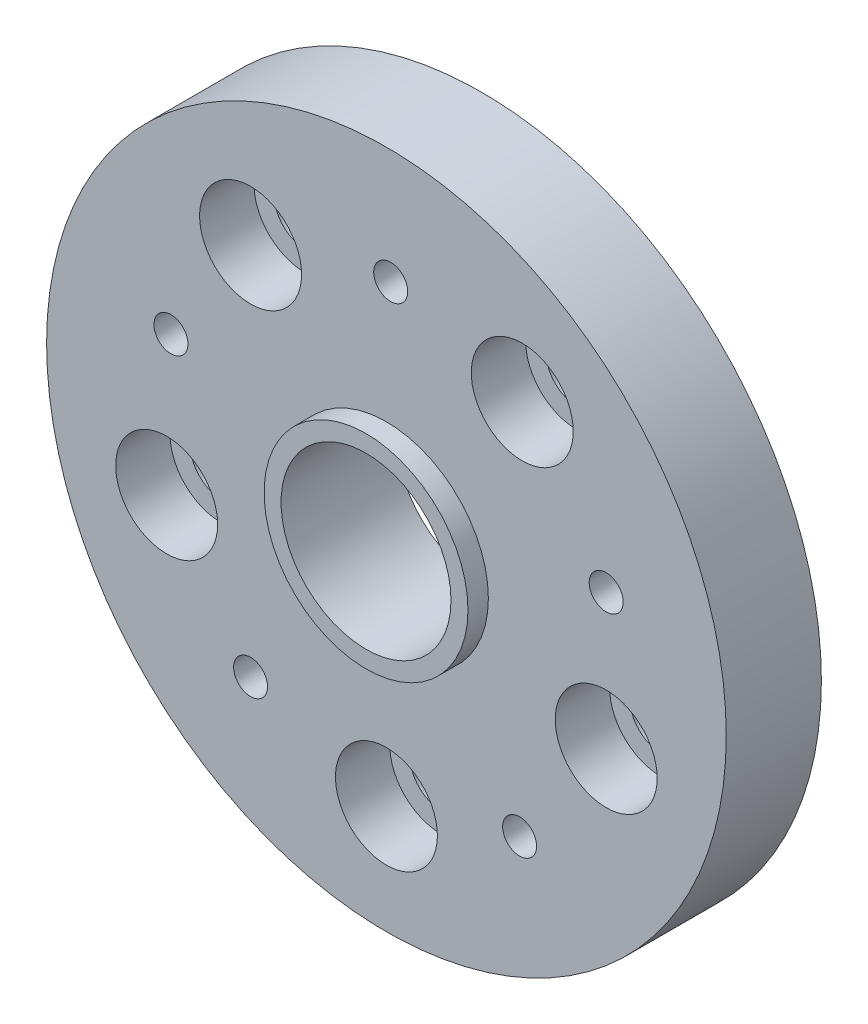
ISO-10303-21;
HEADER;
FILE_DESCRIPTION(('STEP AP214'),'2;1');
FILE_NAME('part.step','',(''),(''),'','','');
FILE_SCHEMA(('AUTOMOTIVE_DESIGN { 1 0 10303 214 1 1 1 1 }'));
ENDSEC;
DATA;
#1=APPLICATION_CONTEXT('core data for automotive mechanical design processes');
#2=APPLICATION_PROTOCOL_DEFINITION('international standard','automotive_design',2000,#1);
#3=PRODUCT_CONTEXT('',#1,'mechanical');
#4=PRODUCT('Part','Part','',(#3));
#5=PRODUCT_RELATED_PRODUCT_CATEGORY('part','',(#4));
#6=PRODUCT_DEFINITION_FORMATION('','',#4);
#7=PRODUCT_DEFINITION_CONTEXT('part definition',#1,'design');
#8=PRODUCT_DEFINITION('design','',#6,#7);
#9=PRODUCT_DEFINITION_SHAPE('','',#8);
#10=(LENGTH_UNIT() NAMED_UNIT(*) SI_UNIT(.MILLI.,.METRE.));
#11=(NAMED_UNIT(*) PLANE_ANGLE_UNIT() SI_UNIT($,.RADIAN.));
#12=(NAMED_UNIT(*) SI_UNIT($,.STERADIAN.) SOLID_ANGLE_UNIT());
#13=UNCERTAINTY_MEASURE_WITH_UNIT(LENGTH_MEASURE(1.E-05),#10,'distance_accuracy_value','');
#14=(GEOMETRIC_REPRESENTATION_CONTEXT(3) GLOBAL_UNCERTAINTY_ASSIGNED_CONTEXT((#13)) GLOBAL_UNIT_ASSIGNED_CONTEXT((#10,
#11,#12)) REPRESENTATION_CONTEXT('',''));
#15=CARTESIAN_POINT('',(0.,0.,0.));
#16=DIRECTION('',(0.,0.,1.));
#17=DIRECTION('',(1.,0.,0.));
#18=AXIS2_PLACEMENT_3D('',#15,#16,#17);
#19=CARTESIAN_POINT('',(0.,0.,14.));
#20=DIRECTION('',(0.,0.,1.));
#21=DIRECTION('',(1.,0.,0.));
#22=AXIS2_PLACEMENT_3D('',#19,#20,#21);
#23=PLANE('',#22);
#24=CARTESIAN_POINT('',(-19.9846985779441,-27.5065778087482,14.));
#25=DIRECTION('',(0.,0.,1.));
#26=DIRECTION('',(1.,0.,0.));
#27=AXIS2_PLACEMENT_3D('',#24,#25,#26);
#28=CIRCLE('',#27,2.5);
#29=CARTESIAN_POINT('',(-17.4846985779441,-27.5065778087482,14.));
#30=VERTEX_POINT('',#29);
#31=EDGE_CURVE('E154',#30,#30,#28,.T.);
#32=ORIENTED_EDGE('',*,*,#31,.F.);
#33=EDGE_LOOP('',(#32));
#34=FACE_BOUND('',#33,.T.);
#35=CARTESIAN_POINT('',(-31.7058466119896,10.3018540499749,14.));
#36=DIRECTION('',(0.,0.,1.));
#37=DIRECTION('',(1.,0.,0.));
#38=AXIS2_PLACEMENT_3D('',#35,#36,#37);
#39=CIRCLE('',#38,2.5);
#40=CARTESIAN_POINT('',(-29.2058466119896,10.3018540499749,14.));
#41=VERTEX_POINT('',#40);
#42=EDGE_CURVE('E148',#41,#41,#39,.T.);
#43=ORIENTED_EDGE('',*,*,#42,.F.);
#44=EDGE_LOOP('',(#43));
#45=FACE_BOUND('',#44,.T.);
#46=CARTESIAN_POINT('',(0.630074942045694,33.1327762412267,14.));
#47=DIRECTION('',(0.,0.,1.));
#48=DIRECTION('',(1.,0.,0.));
#49=AXIS2_PLACEMENT_3D('',#46,#47,#48);
#50=CIRCLE('',#49,2.5);
#51=CARTESIAN_POINT('',(3.13007494204569,33.1327762412267,14.));
#52=VERTEX_POINT('',#51);
#53=EDGE_CURVE('E142',#52,#52,#50,.T.);
#54=ORIENTED_EDGE('',*,*,#53,.F.);
#55=EDGE_LOOP('',(#54));
#56=FACE_BOUND('',#55,.T.);
#57=CARTESIAN_POINT('',(32.3359215540354,9.43463029120137,14.));
#58=DIRECTION('',(0.,0.,1.));
#59=DIRECTION('',(1.,0.,0.));
#60=AXIS2_PLACEMENT_3D('',#57,#58,#59);
#61=CIRCLE('',#60,2.5);
#62=CARTESIAN_POINT('',(34.8359215540354,9.43463029120137,14.));
#63=VERTEX_POINT('',#62);
#64=EDGE_CURVE('E136',#63,#63,#61,.T.);
#65=ORIENTED_EDGE('',*,*,#64,.F.);
#66=EDGE_LOOP('',(#65));
#67=FACE_BOUND('',#66,.T.);
#68=CARTESIAN_POINT('',(19.5952908483004,-28.0425515675217,14.));
#69=DIRECTION('',(0.,0.,1.));
#70=DIRECTION('',(1.,0.,0.));
#71=AXIS2_PLACEMENT_3D('',#68,#69,#70);
#72=CIRCLE('',#71,2.5);
#73=CARTESIAN_POINT('',(22.0952908483004,-28.0425515675217,14.));
#74=VERTEX_POINT('',#73);
#75=EDGE_CURVE('E130',#74,#74,#72,.T.);
#76=ORIENTED_EDGE('',*,*,#75,.F.);
#77=EDGE_LOOP('',(#76));
#78=FACE_BOUND('',#77,.T.);
#79=CARTESIAN_POINT('',(0.,-34.,14.));
#80=DIRECTION('',(0.,0.,1.));
#81=DIRECTION('',(1.,0.,0.));
#82=AXIS2_PLACEMENT_3D('',#79,#80,#81);
#83=CIRCLE('',#82,7.5);
#84=CARTESIAN_POINT('',(7.5,-34.,14.));
#85=VERTEX_POINT('',#84);
#86=EDGE_CURVE('E124',#85,#85,#83,.T.);
#87=ORIENTED_EDGE('',*,*,#86,.F.);
#88=EDGE_LOOP('',(#87));
#89=FACE_BOUND('',#88,.T.);
#90=CARTESIAN_POINT('',(-32.3359215540352,-10.5065778087482,14.));
#91=DIRECTION('',(0.,0.,1.));
#92=DIRECTION('',(1.,0.,0.));
#93=AXIS2_PLACEMENT_3D('',#90,#91,#92);
#94=CIRCLE('',#93,7.5);
#95=CARTESIAN_POINT('',(-24.8359215540352,-10.5065778087482,14.));
#96=VERTEX_POINT('',#95);
#97=EDGE_CURVE('E112',#96,#96,#94,.T.);
#98=ORIENTED_EDGE('',*,*,#97,.F.);
#99=EDGE_LOOP('',(#98));
#100=FACE_BOUND('',#99,.T.);
#101=CARTESIAN_POINT('',(-19.9846985779441,27.5065778087482,14.));
#102=DIRECTION('',(0.,0.,1.));
#103=DIRECTION('',(1.,0.,0.));
#104=AXIS2_PLACEMENT_3D('',#101,#102,#103);
#105=CIRCLE('',#104,7.5);
#106=CARTESIAN_POINT('',(-12.4846985779441,27.5065778087482,14.));
#107=VERTEX_POINT('',#106);
#108=EDGE_CURVE('E100',#107,#107,#105,.T.);
#109=ORIENTED_EDGE('',*,*,#108,.F.);
#110=EDGE_LOOP('',(#109));
#111=FACE_BOUND('',#110,.T.);
#112=CARTESIAN_POINT('',(19.9846985779441,27.5065778087482,14.));
#113=DIRECTION('',(0.,0.,1.));
#114=DIRECTION('',(1.,0.,0.));
#115=AXIS2_PLACEMENT_3D('',#112,#113,#114);
#116=CIRCLE('',#115,7.5);
#117=CARTESIAN_POINT('',(27.4846985779441,27.5065778087482,14.));
#118=VERTEX_POINT('',#117);
#119=EDGE_CURVE('E88',#118,#118,#116,.T.);
#120=ORIENTED_EDGE('',*,*,#119,.F.);
#121=EDGE_LOOP('',(#120));
#122=FACE_BOUND('',#121,.T.);
#123=CARTESIAN_POINT('',(32.3359215540352,-10.5065778087482,14.));
#124=DIRECTION('',(0.,0.,1.));
#125=DIRECTION('',(1.,0.,0.));
#126=AXIS2_PLACEMENT_3D('',#123,#124,#125);
#127=CIRCLE('',#126,7.5);
#128=CARTESIAN_POINT('',(39.8359215540352,-10.5065778087482,14.));
#129=VERTEX_POINT('',#128);
#130=EDGE_CURVE('E76',#129,#129,#127,.T.);
#131=ORIENTED_EDGE('',*,*,#130,.F.);
#132=EDGE_LOOP('',(#131));
#133=FACE_BOUND('',#132,.T.);
#134=CARTESIAN_POINT('',(0.,0.,14.));
#135=DIRECTION('',(0.,0.,1.));
#136=DIRECTION('',(1.,0.,0.));
#137=AXIS2_PLACEMENT_3D('',#134,#135,#136);
#138=CIRCLE('',#137,50.);
#139=CARTESIAN_POINT('',(50.,0.,14.));
#140=VERTEX_POINT('',#139);
#141=EDGE_CURVE('E10',#140,#140,#138,.T.);
#142=ORIENTED_EDGE('',*,*,#141,.T.);
#143=EDGE_LOOP('',(#142));
#144=FACE_BOUND('',#143,.T.);
#145=CARTESIAN_POINT('',(0.,0.,14.));
#146=DIRECTION('',(0.,0.,1.));
#147=DIRECTION('',(1.,0.,0.));
#148=AXIS2_PLACEMENT_3D('',#145,#146,#147);
#149=CIRCLE('',#148,15.);
#150=CARTESIAN_POINT('',(15.,0.,14.));
#151=VERTEX_POINT('',#150);
#152=EDGE_CURVE('E58',#151,#151,#149,.T.);
#153=ORIENTED_EDGE('',*,*,#152,.F.);
#154=EDGE_LOOP('',(#153));
#155=FACE_BOUND('',#154,.T.);
#156=ADVANCED_FACE('F38',(#34,#45,#56,#67,#78,#89,#100,#111,#122,#133,#144,#155),#23,.T.);
#157=CARTESIAN_POINT('',(0.,0.,14.));
#158=DIRECTION('',(0.,0.,-1.));
#159=DIRECTION('',(-1.,0.,0.));
#160=AXIS2_PLACEMENT_3D('',#157,#158,#159);
#161=CYLINDRICAL_SURFACE('',#160,50.);
#162=ORIENTED_EDGE('',*,*,#141,.F.);
#163=EDGE_LOOP('',(#162));
#164=FACE_BOUND('',#163,.T.);
#165=CARTESIAN_POINT('',(0.,0.,0.));
#166=DIRECTION('',(0.,0.,1.));
#167=DIRECTION('',(1.,0.,0.));
#168=AXIS2_PLACEMENT_3D('',#165,#166,#167);
#169=CIRCLE('',#168,50.);
#170=CARTESIAN_POINT('',(50.,0.,0.));
#171=VERTEX_POINT('',#170);
#172=EDGE_CURVE('E42',#171,#171,#169,.T.);
#173=ORIENTED_EDGE('',*,*,#172,.T.);
#174=EDGE_LOOP('',(#173));
#175=FACE_BOUND('',#174,.T.);
#176=ADVANCED_FACE('F40',(#164,#175),#161,.T.);
#177=CARTESIAN_POINT('',(0.,0.,0.));
#178=DIRECTION('',(0.,0.,1.));
#179=DIRECTION('',(1.,0.,0.));
#180=AXIS2_PLACEMENT_3D('',#177,#178,#179);
#181=PLANE('',#180);
#182=CARTESIAN_POINT('',(-19.9846985779441,-27.5065778087482,0.));
#183=DIRECTION('',(0.,0.,1.));
#184=DIRECTION('',(1.,0.,0.));
#185=AXIS2_PLACEMENT_3D('',#182,#183,#184);
#186=CIRCLE('',#185,2.5);
#187=CARTESIAN_POINT('',(-17.4846985779441,-27.5065778087482,0.));
#188=VERTEX_POINT('',#187);
#189=EDGE_CURVE('E151',#188,#188,#186,.T.);
#190=ORIENTED_EDGE('',*,*,#189,.T.);
#191=EDGE_LOOP('',(#190));
#192=FACE_BOUND('',#191,.T.);
#193=CARTESIAN_POINT('',(-31.7058466119896,10.3018540499749,0.));
#194=DIRECTION('',(0.,0.,1.));
#195=DIRECTION('',(1.,0.,0.));
#196=AXIS2_PLACEMENT_3D('',#193,#194,#195);
#197=CIRCLE('',#196,2.5);
#198=CARTESIAN_POINT('',(-29.2058466119896,10.3018540499749,0.));
#199=VERTEX_POINT('',#198);
#200=EDGE_CURVE('E145',#199,#199,#197,.T.);
#201=ORIENTED_EDGE('',*,*,#200,.T.);
#202=EDGE_LOOP('',(#201));
#203=FACE_BOUND('',#202,.T.);
#204=CARTESIAN_POINT('',(0.630074942045694,33.1327762412267,0.));
#205=DIRECTION('',(0.,0.,1.));
#206=DIRECTION('',(1.,0.,0.));
#207=AXIS2_PLACEMENT_3D('',#204,#205,#206);
#208=CIRCLE('',#207,2.5);
#209=CARTESIAN_POINT('',(3.13007494204569,33.1327762412267,0.));
#210=VERTEX_POINT('',#209);
#211=EDGE_CURVE('E139',#210,#210,#208,.T.);
#212=ORIENTED_EDGE('',*,*,#211,.T.);
#213=EDGE_LOOP('',(#212));
#214=FACE_BOUND('',#213,.T.);
#215=CARTESIAN_POINT('',(32.3359215540354,9.43463029120137,0.));
#216=DIRECTION('',(0.,0.,1.));
#217=DIRECTION('',(1.,0.,0.));
#218=AXIS2_PLACEMENT_3D('',#215,#216,#217);
#219=CIRCLE('',#218,2.5);
#220=CARTESIAN_POINT('',(34.8359215540354,9.43463029120137,0.));
#221=VERTEX_POINT('',#220);
#222=EDGE_CURVE('E133',#221,#221,#219,.T.);
#223=ORIENTED_EDGE('',*,*,#222,.T.);
#224=EDGE_LOOP('',(#223));
#225=FACE_BOUND('',#224,.T.);
#226=CARTESIAN_POINT('',(19.5952908483004,-28.0425515675217,0.));
#227=DIRECTION('',(0.,0.,1.));
#228=DIRECTION('',(1.,0.,0.));
#229=AXIS2_PLACEMENT_3D('',#226,#227,#228);
#230=CIRCLE('',#229,2.5);
#231=CARTESIAN_POINT('',(22.0952908483004,-28.0425515675217,0.));
#232=VERTEX_POINT('',#231);
#233=EDGE_CURVE('E127',#232,#232,#230,.T.);
#234=ORIENTED_EDGE('',*,*,#233,.T.);
#235=EDGE_LOOP('',(#234));
#236=FACE_BOUND('',#235,.T.);
#237=CARTESIAN_POINT('',(0.,-34.,0.));
#238=DIRECTION('',(0.,0.,1.));
#239=DIRECTION('',(1.,0.,0.));
#240=AXIS2_PLACEMENT_3D('',#237,#238,#239);
#241=CIRCLE('',#240,4.5);
#242=CARTESIAN_POINT('',(4.5,-34.,0.));
#243=VERTEX_POINT('',#242);
#244=EDGE_CURVE('E115',#243,#243,#241,.T.);
#245=ORIENTED_EDGE('',*,*,#244,.T.);
#246=EDGE_LOOP('',(#245));
#247=FACE_BOUND('',#246,.T.);
#248=CARTESIAN_POINT('',(-32.3359215540352,-10.5065778087482,0.));
#249=DIRECTION('',(0.,0.,1.));
#250=DIRECTION('',(1.,0.,0.));
#251=AXIS2_PLACEMENT_3D('',#248,#249,#250);
#252=CIRCLE('',#251,4.5);
#253=CARTESIAN_POINT('',(-27.8359215540352,-10.5065778087482,0.));
#254=VERTEX_POINT('',#253);
#255=EDGE_CURVE('E103',#254,#254,#252,.T.);
#256=ORIENTED_EDGE('',*,*,#255,.T.);
#257=EDGE_LOOP('',(#256));
#258=FACE_BOUND('',#257,.T.);
#259=CARTESIAN_POINT('',(-19.9846985779441,27.5065778087482,0.));
#260=DIRECTION('',(0.,0.,1.));
#261=DIRECTION('',(1.,0.,0.));
#262=AXIS2_PLACEMENT_3D('',#259,#260,#261);
#263=CIRCLE('',#262,4.5);
#264=CARTESIAN_POINT('',(-15.4846985779441,27.5065778087482,0.));
#265=VERTEX_POINT('',#264);
#266=EDGE_CURVE('E91',#265,#265,#263,.T.);
#267=ORIENTED_EDGE('',*,*,#266,.T.);
#268=EDGE_LOOP('',(#267));
#269=FACE_BOUND('',#268,.T.);
#270=CARTESIAN_POINT('',(19.9846985779441,27.5065778087482,0.));
#271=DIRECTION('',(0.,0.,1.));
#272=DIRECTION('',(1.,0.,0.));
#273=AXIS2_PLACEMENT_3D('',#270,#271,#272);
#274=CIRCLE('',#273,4.5);
#275=CARTESIAN_POINT('',(24.4846985779441,27.5065778087482,0.));
#276=VERTEX_POINT('',#275);
#277=EDGE_CURVE('E79',#276,#276,#274,.T.);
#278=ORIENTED_EDGE('',*,*,#277,.T.);
#279=EDGE_LOOP('',(#278));
#280=FACE_BOUND('',#279,.T.);
#281=CARTESIAN_POINT('',(32.3359215540352,-10.5065778087482,0.));
#282=DIRECTION('',(0.,0.,1.));
#283=DIRECTION('',(1.,0.,0.));
#284=AXIS2_PLACEMENT_3D('',#281,#282,#283);
#285=CIRCLE('',#284,4.5);
#286=CARTESIAN_POINT('',(36.8359215540352,-10.5065778087482,0.));
#287=VERTEX_POINT('',#286);
#288=EDGE_CURVE('E67',#287,#287,#285,.T.);
#289=ORIENTED_EDGE('',*,*,#288,.T.);
#290=EDGE_LOOP('',(#289));
#291=FACE_BOUND('',#290,.T.);
#292=CARTESIAN_POINT('',(0.,0.,0.));
#293=DIRECTION('',(0.,0.,1.));
#294=DIRECTION('',(1.,0.,0.));
#295=AXIS2_PLACEMENT_3D('',#292,#293,#294);
#296=CIRCLE('',#295,12.5);
#297=CARTESIAN_POINT('',(12.5,0.,0.));
#298=VERTEX_POINT('',#297);
#299=EDGE_CURVE('E53',#298,#298,#296,.T.);
#300=ORIENTED_EDGE('',*,*,#299,.T.);
#301=EDGE_LOOP('',(#300));
#302=FACE_BOUND('',#301,.T.);
#303=ORIENTED_EDGE('',*,*,#172,.F.);
#304=EDGE_LOOP('',(#303));
#305=FACE_BOUND('',#304,.T.);
#306=ADVANCED_FACE('F202',(#192,#203,#214,#225,#236,#247,#258,#269,#280,#291,#302,#305),#181,.F.);
#307=CARTESIAN_POINT('',(0.,0.,0.));
#308=DIRECTION('',(0.,0.,1.));
#309=DIRECTION('',(1.,0.,0.));
#310=AXIS2_PLACEMENT_3D('',#307,#308,#309);
#311=CYLINDRICAL_SURFACE('',#310,12.5);
#312=ORIENTED_EDGE('',*,*,#299,.F.);
#313=EDGE_LOOP('',(#312));
#314=FACE_BOUND('',#313,.T.);
#315=CARTESIAN_POINT('',(0.,0.,17.));
#316=DIRECTION('',(0.,0.,1.));
#317=DIRECTION('',(1.,0.,0.));
#318=AXIS2_PLACEMENT_3D('',#315,#316,#317);
#319=CIRCLE('',#318,12.5);
#320=CARTESIAN_POINT('',(12.5,0.,17.));
#321=VERTEX_POINT('',#320);
#322=EDGE_CURVE('E61',#321,#321,#319,.T.);
#323=ORIENTED_EDGE('',*,*,#322,.T.);
#324=EDGE_LOOP('',(#323));
#325=FACE_BOUND('',#324,.T.);
#326=ADVANCED_FACE('F196',(#314,#325),#311,.F.);
#327=CARTESIAN_POINT('',(0.,0.,17.));
#328=DIRECTION('',(0.,0.,1.));
#329=DIRECTION('',(1.,0.,0.));
#330=AXIS2_PLACEMENT_3D('',#327,#328,#329);
#331=PLANE('',#330);
#332=CARTESIAN_POINT('',(0.,0.,17.));
#333=DIRECTION('',(0.,0.,1.));
#334=DIRECTION('',(1.,0.,0.));
#335=AXIS2_PLACEMENT_3D('',#332,#333,#334);
#336=CIRCLE('',#335,15.);
#337=CARTESIAN_POINT('',(15.,0.,17.));
#338=VERTEX_POINT('',#337);
#339=EDGE_CURVE('E57',#338,#338,#336,.T.);
#340=ORIENTED_EDGE('',*,*,#339,.T.);
#341=EDGE_LOOP('',(#340));
#342=FACE_BOUND('',#341,.T.);
#343=ORIENTED_EDGE('',*,*,#322,.F.);
#344=EDGE_LOOP('',(#343));
#345=FACE_BOUND('',#344,.T.);
#346=ADVANCED_FACE('F186',(#342,#345),#331,.T.);
#347=CARTESIAN_POINT('',(0.,0.,17.));
#348=DIRECTION('',(0.,0.,-1.));
#349=DIRECTION('',(-1.,0.,0.));
#350=AXIS2_PLACEMENT_3D('',#347,#348,#349);
#351=CYLINDRICAL_SURFACE('',#350,15.);
#352=ORIENTED_EDGE('',*,*,#339,.F.);
#353=EDGE_LOOP('',(#352));
#354=FACE_BOUND('',#353,.T.);
#355=ORIENTED_EDGE('',*,*,#152,.T.);
#356=EDGE_LOOP('',(#355));
#357=FACE_BOUND('',#356,.T.);
#358=ADVANCED_FACE('F183',(#354,#357),#351,.T.);
#359=CARTESIAN_POINT('',(32.3359215540352,-10.5065778087482,14.));
#360=DIRECTION('',(0.,0.,1.));
#361=DIRECTION('',(1.,0.,0.));
#362=AXIS2_PLACEMENT_3D('',#359,#360,#361);
#363=CYLINDRICAL_SURFACE('',#362,4.5);
#364=ORIENTED_EDGE('',*,*,#288,.F.);
#365=EDGE_LOOP('',(#364));
#366=FACE_BOUND('',#365,.T.);
#367=CARTESIAN_POINT('',(32.3359215540352,-10.5065778087482,6.));
#368=DIRECTION('',(0.,0.,1.));
#369=DIRECTION('',(1.,0.,0.));
#370=AXIS2_PLACEMENT_3D('',#367,#368,#369);
#371=CIRCLE('',#370,4.5);
#372=CARTESIAN_POINT('',(36.8359215540352,-10.5065778087482,6.));
#373=VERTEX_POINT('',#372);
#374=EDGE_CURVE('E70',#373,#373,#371,.T.);
#375=ORIENTED_EDGE('',*,*,#374,.T.);
#376=EDGE_LOOP('',(#375));
#377=FACE_BOUND('',#376,.T.);
#378=ADVANCED_FACE('F185',(#366,#377),#363,.F.);
#379=CARTESIAN_POINT('',(36.8359215540352,-10.5065778087482,6.));
#380=DIRECTION('',(0.,0.,-1.));
#381=DIRECTION('',(-1.,0.,0.));
#382=AXIS2_PLACEMENT_3D('',#379,#380,#381);
#383=PLANE('',#382);
#384=ORIENTED_EDGE('',*,*,#374,.F.);
#385=EDGE_LOOP('',(#384));
#386=FACE_BOUND('',#385,.T.);
#387=CARTESIAN_POINT('',(32.3359215540352,-10.5065778087482,6.));
#388=DIRECTION('',(0.,0.,1.));
#389=DIRECTION('',(1.,0.,0.));
#390=AXIS2_PLACEMENT_3D('',#387,#388,#389);
#391=CIRCLE('',#390,7.5);
#392=CARTESIAN_POINT('',(39.8359215540352,-10.5065778087482,6.));
#393=VERTEX_POINT('',#392);
#394=EDGE_CURVE('E73',#393,#393,#391,.T.);
#395=ORIENTED_EDGE('',*,*,#394,.T.);
#396=EDGE_LOOP('',(#395));
#397=FACE_BOUND('',#396,.T.);
#398=ADVANCED_FACE('F193',(#386,#397),#383,.F.);
#399=CARTESIAN_POINT('',(32.3359215540352,-10.5065778087482,14.));
#400=DIRECTION('',(0.,0.,1.));
#401=DIRECTION('',(1.,0.,0.));
#402=AXIS2_PLACEMENT_3D('',#399,#400,#401);
#403=CYLINDRICAL_SURFACE('',#402,7.5);
#404=ORIENTED_EDGE('',*,*,#394,.F.);
#405=EDGE_LOOP('',(#404));
#406=FACE_BOUND('',#405,.T.);
#407=ORIENTED_EDGE('',*,*,#130,.T.);
#408=EDGE_LOOP('',(#407));
#409=FACE_BOUND('',#408,.T.);
#410=ADVANCED_FACE('F242',(#406,#409),#403,.F.);
#411=CARTESIAN_POINT('',(19.9846985779441,27.5065778087482,14.));
#412=DIRECTION('',(0.,0.,1.));
#413=DIRECTION('',(1.,0.,0.));
#414=AXIS2_PLACEMENT_3D('',#411,#412,#413);
#415=CYLINDRICAL_SURFACE('',#414,4.5);
#416=ORIENTED_EDGE('',*,*,#277,.F.);
#417=EDGE_LOOP('',(#416));
#418=FACE_BOUND('',#417,.T.);
#419=CARTESIAN_POINT('',(19.9846985779441,27.5065778087482,6.));
#420=DIRECTION('',(0.,0.,1.));
#421=DIRECTION('',(1.,0.,0.));
#422=AXIS2_PLACEMENT_3D('',#419,#420,#421);
#423=CIRCLE('',#422,4.5);
#424=CARTESIAN_POINT('',(24.4846985779441,27.5065778087482,6.));
#425=VERTEX_POINT('',#424);
#426=EDGE_CURVE('E82',#425,#425,#423,.T.);
#427=ORIENTED_EDGE('',*,*,#426,.T.);
#428=EDGE_LOOP('',(#427));
#429=FACE_BOUND('',#428,.T.);
#430=ADVANCED_FACE('F248',(#418,#429),#415,.F.);
#431=CARTESIAN_POINT('',(24.4846985779441,27.5065778087482,6.));
#432=DIRECTION('',(0.,0.,-1.));
#433=DIRECTION('',(-1.,0.,0.));
#434=AXIS2_PLACEMENT_3D('',#431,#432,#433);
#435=PLANE('',#434);
#436=ORIENTED_EDGE('',*,*,#426,.F.);
#437=EDGE_LOOP('',(#436));
#438=FACE_BOUND('',#437,.T.);
#439=CARTESIAN_POINT('',(19.9846985779441,27.5065778087482,6.));
#440=DIRECTION('',(0.,0.,1.));
#441=DIRECTION('',(1.,0.,0.));
#442=AXIS2_PLACEMENT_3D('',#439,#440,#441);
#443=CIRCLE('',#442,7.5);
#444=CARTESIAN_POINT('',(27.4846985779441,27.5065778087482,6.));
#445=VERTEX_POINT('',#444);
#446=EDGE_CURVE('E85',#445,#445,#443,.T.);
#447=ORIENTED_EDGE('',*,*,#446,.T.);
#448=EDGE_LOOP('',(#447));
#449=FACE_BOUND('',#448,.T.);
#450=ADVANCED_FACE('F253',(#438,#449),#435,.F.);
#451=CARTESIAN_POINT('',(19.9846985779441,27.5065778087482,14.));
#452=DIRECTION('',(0.,0.,1.));
#453=DIRECTION('',(1.,0.,0.));
#454=AXIS2_PLACEMENT_3D('',#451,#452,#453);
#455=CYLINDRICAL_SURFACE('',#454,7.5);
#456=ORIENTED_EDGE('',*,*,#446,.F.);
#457=EDGE_LOOP('',(#456));
#458=FACE_BOUND('',#457,.T.);
#459=ORIENTED_EDGE('',*,*,#119,.T.);
#460=EDGE_LOOP('',(#459));
#461=FACE_BOUND('',#460,.T.);
#462=ADVANCED_FACE('F259',(#458,#461),#455,.F.);
#463=CARTESIAN_POINT('',(-19.9846985779441,27.5065778087482,14.));
#464=DIRECTION('',(0.,0.,1.));
#465=DIRECTION('',(1.,0.,0.));
#466=AXIS2_PLACEMENT_3D('',#463,#464,#465);
#467=CYLINDRICAL_SURFACE('',#466,4.5);
#468=ORIENTED_EDGE('',*,*,#266,.F.);
#469=EDGE_LOOP('',(#468));
#470=FACE_BOUND('',#469,.T.);
#471=CARTESIAN_POINT('',(-19.9846985779441,27.5065778087482,6.));
#472=DIRECTION('',(0.,0.,1.));
#473=DIRECTION('',(1.,0.,0.));
#474=AXIS2_PLACEMENT_3D('',#471,#472,#473);
#475=CIRCLE('',#474,4.5);
#476=CARTESIAN_POINT('',(-15.4846985779441,27.5065778087482,6.));
#477=VERTEX_POINT('',#476);
#478=EDGE_CURVE('E94',#477,#477,#475,.T.);
#479=ORIENTED_EDGE('',*,*,#478,.T.);
#480=EDGE_LOOP('',(#479));
#481=FACE_BOUND('',#480,.T.);
#482=ADVANCED_FACE('F263',(#470,#481),#467,.F.);
#483=CARTESIAN_POINT('',(-15.4846985779441,27.5065778087482,6.));
#484=DIRECTION('',(0.,0.,-1.));
#485=DIRECTION('',(-1.,0.,0.));
#486=AXIS2_PLACEMENT_3D('',#483,#484,#485);
#487=PLANE('',#486);
#488=ORIENTED_EDGE('',*,*,#478,.F.);
#489=EDGE_LOOP('',(#488));
#490=FACE_BOUND('',#489,.T.);
#491=CARTESIAN_POINT('',(-19.9846985779441,27.5065778087482,6.));
#492=DIRECTION('',(0.,0.,1.));
#493=DIRECTION('',(1.,0.,0.));
#494=AXIS2_PLACEMENT_3D('',#491,#492,#493);
#495=CIRCLE('',#494,7.5);
#496=CARTESIAN_POINT('',(-12.4846985779441,27.5065778087482,6.));
#497=VERTEX_POINT('',#496);
#498=EDGE_CURVE('E97',#497,#497,#495,.T.);
#499=ORIENTED_EDGE('',*,*,#498,.T.);
#500=EDGE_LOOP('',(#499));
#501=FACE_BOUND('',#500,.T.);
#502=ADVANCED_FACE('F267',(#490,#501),#487,.F.);
#503=CARTESIAN_POINT('',(-19.9846985779441,27.5065778087482,14.));
#504=DIRECTION('',(0.,0.,1.));
#505=DIRECTION('',(1.,0.,0.));
#506=AXIS2_PLACEMENT_3D('',#503,#504,#505);
#507=CYLINDRICAL_SURFACE('',#506,7.5);
#508=ORIENTED_EDGE('',*,*,#498,.F.);
#509=EDGE_LOOP('',(#508));
#510=FACE_BOUND('',#509,.T.);
#511=ORIENTED_EDGE('',*,*,#108,.T.);
#512=EDGE_LOOP('',(#511));
#513=FACE_BOUND('',#512,.T.);
#514=ADVANCED_FACE('F271',(#510,#513),#507,.F.);
#515=CARTESIAN_POINT('',(-32.3359215540352,-10.5065778087482,14.));
#516=DIRECTION('',(0.,0.,1.));
#517=DIRECTION('',(1.,0.,0.));
#518=AXIS2_PLACEMENT_3D('',#515,#516,#517);
#519=CYLINDRICAL_SURFACE('',#518,4.5);
#520=ORIENTED_EDGE('',*,*,#255,.F.);
#521=EDGE_LOOP('',(#520));
#522=FACE_BOUND('',#521,.T.);
#523=CARTESIAN_POINT('',(-32.3359215540352,-10.5065778087482,6.));
#524=DIRECTION('',(0.,0.,1.));
#525=DIRECTION('',(1.,0.,0.));
#526=AXIS2_PLACEMENT_3D('',#523,#524,#525);
#527=CIRCLE('',#526,4.5);
#528=CARTESIAN_POINT('',(-27.8359215540352,-10.5065778087482,6.));
#529=VERTEX_POINT('',#528);
#530=EDGE_CURVE('E106',#529,#529,#527,.T.);
#531=ORIENTED_EDGE('',*,*,#530,.T.);
#532=EDGE_LOOP('',(#531));
#533=FACE_BOUND('',#532,.T.);
#534=ADVANCED_FACE('F275',(#522,#533),#519,.F.);
#535=CARTESIAN_POINT('',(-27.8359215540352,-10.5065778087482,6.));
#536=DIRECTION('',(0.,0.,-1.));
#537=DIRECTION('',(-1.,0.,0.));
#538=AXIS2_PLACEMENT_3D('',#535,#536,#537);
#539=PLANE('',#538);
#540=ORIENTED_EDGE('',*,*,#530,.F.);
#541=EDGE_LOOP('',(#540));
#542=FACE_BOUND('',#541,.T.);
#543=CARTESIAN_POINT('',(-32.3359215540352,-10.5065778087482,6.));
#544=DIRECTION('',(0.,0.,1.));
#545=DIRECTION('',(1.,0.,0.));
#546=AXIS2_PLACEMENT_3D('',#543,#544,#545);
#547=CIRCLE('',#546,7.5);
#548=CARTESIAN_POINT('',(-24.8359215540352,-10.5065778087482,6.));
#549=VERTEX_POINT('',#548);
#550=EDGE_CURVE('E109',#549,#549,#547,.T.);
#551=ORIENTED_EDGE('',*,*,#550,.T.);
#552=EDGE_LOOP('',(#551));
#553=FACE_BOUND('',#552,.T.);
#554=ADVANCED_FACE('F279',(#542,#553),#539,.F.);
#555=CARTESIAN_POINT('',(-32.3359215540352,-10.5065778087482,14.));
#556=DIRECTION('',(0.,0.,1.));
#557=DIRECTION('',(1.,0.,0.));
#558=AXIS2_PLACEMENT_3D('',#555,#556,#557);
#559=CYLINDRICAL_SURFACE('',#558,7.5);
#560=ORIENTED_EDGE('',*,*,#550,.F.);
#561=EDGE_LOOP('',(#560));
#562=FACE_BOUND('',#561,.T.);
#563=ORIENTED_EDGE('',*,*,#97,.T.);
#564=EDGE_LOOP('',(#563));
#565=FACE_BOUND('',#564,.T.);
#566=ADVANCED_FACE('F283',(#562,#565),#559,.F.);
#567=CARTESIAN_POINT('',(0.,-34.,14.));
#568=DIRECTION('',(0.,0.,1.));
#569=DIRECTION('',(1.,0.,0.));
#570=AXIS2_PLACEMENT_3D('',#567,#568,#569);
#571=CYLINDRICAL_SURFACE('',#570,4.5);
#572=ORIENTED_EDGE('',*,*,#244,.F.);
#573=EDGE_LOOP('',(#572));
#574=FACE_BOUND('',#573,.T.);
#575=CARTESIAN_POINT('',(0.,-34.,6.));
#576=DIRECTION('',(0.,0.,1.));
#577=DIRECTION('',(1.,0.,0.));
#578=AXIS2_PLACEMENT_3D('',#575,#576,#577);
#579=CIRCLE('',#578,4.5);
#580=CARTESIAN_POINT('',(4.5,-34.,6.));
#581=VERTEX_POINT('',#580);
#582=EDGE_CURVE('E118',#581,#581,#579,.T.);
#583=ORIENTED_EDGE('',*,*,#582,.T.);
#584=EDGE_LOOP('',(#583));
#585=FACE_BOUND('',#584,.T.);
#586=ADVANCED_FACE('F287',(#574,#585),#571,.F.);
#587=CARTESIAN_POINT('',(4.5,-34.,6.));
#588=DIRECTION('',(0.,0.,-1.));
#589=DIRECTION('',(-1.,0.,0.));
#590=AXIS2_PLACEMENT_3D('',#587,#588,#589);
#591=PLANE('',#590);
#592=ORIENTED_EDGE('',*,*,#582,.F.);
#593=EDGE_LOOP('',(#592));
#594=FACE_BOUND('',#593,.T.);
#595=CARTESIAN_POINT('',(0.,-34.,6.));
#596=DIRECTION('',(0.,0.,1.));
#597=DIRECTION('',(1.,0.,0.));
#598=AXIS2_PLACEMENT_3D('',#595,#596,#597);
#599=CIRCLE('',#598,7.5);
#600=CARTESIAN_POINT('',(7.5,-34.,6.));
#601=VERTEX_POINT('',#600);
#602=EDGE_CURVE('E121',#601,#601,#599,.T.);
#603=ORIENTED_EDGE('',*,*,#602,.T.);
#604=EDGE_LOOP('',(#603));
#605=FACE_BOUND('',#604,.T.);
#606=ADVANCED_FACE('F291',(#594,#605),#591,.F.);
#607=CARTESIAN_POINT('',(0.,-34.,14.));
#608=DIRECTION('',(0.,0.,1.));
#609=DIRECTION('',(1.,0.,0.));
#610=AXIS2_PLACEMENT_3D('',#607,#608,#609);
#611=CYLINDRICAL_SURFACE('',#610,7.5);
#612=ORIENTED_EDGE('',*,*,#602,.F.);
#613=EDGE_LOOP('',(#612));
#614=FACE_BOUND('',#613,.T.);
#615=ORIENTED_EDGE('',*,*,#86,.T.);
#616=EDGE_LOOP('',(#615));
#617=FACE_BOUND('',#616,.T.);
#618=ADVANCED_FACE('F295',(#614,#617),#611,.F.);
#619=CARTESIAN_POINT('',(19.5952908483004,-28.0425515675217,14.));
#620=DIRECTION('',(0.,0.,1.));
#621=DIRECTION('',(1.,0.,0.));
#622=AXIS2_PLACEMENT_3D('',#619,#620,#621);
#623=CYLINDRICAL_SURFACE('',#622,2.5);
#624=ORIENTED_EDGE('',*,*,#233,.F.);
#625=EDGE_LOOP('',(#624));
#626=FACE_BOUND('',#625,.T.);
#627=ORIENTED_EDGE('',*,*,#75,.T.);
#628=EDGE_LOOP('',(#627));
#629=FACE_BOUND('',#628,.T.);
#630=ADVANCED_FACE('F299',(#626,#629),#623,.F.);
#631=CARTESIAN_POINT('',(32.3359215540354,9.43463029120137,14.));
#632=DIRECTION('',(0.,0.,1.));
#633=DIRECTION('',(1.,0.,0.));
#634=AXIS2_PLACEMENT_3D('',#631,#632,#633);
#635=CYLINDRICAL_SURFACE('',#634,2.5);
#636=ORIENTED_EDGE('',*,*,#222,.F.);
#637=EDGE_LOOP('',(#636));
#638=FACE_BOUND('',#637,.T.);
#639=ORIENTED_EDGE('',*,*,#64,.T.);
#640=EDGE_LOOP('',(#639));
#641=FACE_BOUND('',#640,.T.);
#642=ADVANCED_FACE('F303',(#638,#641),#635,.F.);
#643=CARTESIAN_POINT('',(0.630074942045694,33.1327762412267,14.));
#644=DIRECTION('',(0.,0.,1.));
#645=DIRECTION('',(1.,0.,0.));
#646=AXIS2_PLACEMENT_3D('',#643,#644,#645);
#647=CYLINDRICAL_SURFACE('',#646,2.5);
#648=ORIENTED_EDGE('',*,*,#211,.F.);
#649=EDGE_LOOP('',(#648));
#650=FACE_BOUND('',#649,.T.);
#651=ORIENTED_EDGE('',*,*,#53,.T.);
#652=EDGE_LOOP('',(#651));
#653=FACE_BOUND('',#652,.T.);
#654=ADVANCED_FACE('F307',(#650,#653),#647,.F.);
#655=CARTESIAN_POINT('',(-31.7058466119896,10.3018540499749,14.));
#656=DIRECTION('',(0.,0.,1.));
#657=DIRECTION('',(1.,0.,0.));
#658=AXIS2_PLACEMENT_3D('',#655,#656,#657);
#659=CYLINDRICAL_SURFACE('',#658,2.5);
#660=ORIENTED_EDGE('',*,*,#200,.F.);
#661=EDGE_LOOP('',(#660));
#662=FACE_BOUND('',#661,.T.);
#663=ORIENTED_EDGE('',*,*,#42,.T.);
#664=EDGE_LOOP('',(#663));
#665=FACE_BOUND('',#664,.T.);
#666=ADVANCED_FACE('F311',(#662,#665),#659,.F.);
#667=CARTESIAN_POINT('',(-19.9846985779441,-27.5065778087482,14.));
#668=DIRECTION('',(0.,0.,1.));
#669=DIRECTION('',(1.,0.,0.));
#670=AXIS2_PLACEMENT_3D('',#667,#668,#669);
#671=CYLINDRICAL_SURFACE('',#670,2.5);
#672=ORIENTED_EDGE('',*,*,#189,.F.);
#673=EDGE_LOOP('',(#672));
#674=FACE_BOUND('',#673,.T.);
#675=ORIENTED_EDGE('',*,*,#31,.T.);
#676=EDGE_LOOP('',(#675));
#677=FACE_BOUND('',#676,.T.);
#678=ADVANCED_FACE('F158',(#674,#677),#671,.F.);
#679=CLOSED_SHELL('',(#156,#176,#306,#326,#346,#358,#378,#398,#410,#430,#450,#462,#482,#502,
#514,#534,#554,#566,#586,#606,#618,#630,#642,#654,#666,#678));
#680=MANIFOLD_SOLID_BREP('B2',#679);
#681=ADVANCED_BREP_SHAPE_REPRESENTATION('',(#18,#680),#14);
#682=SHAPE_DEFINITION_REPRESENTATION(#9,#681);
ENDSEC;
END-ISO-10303-21;
